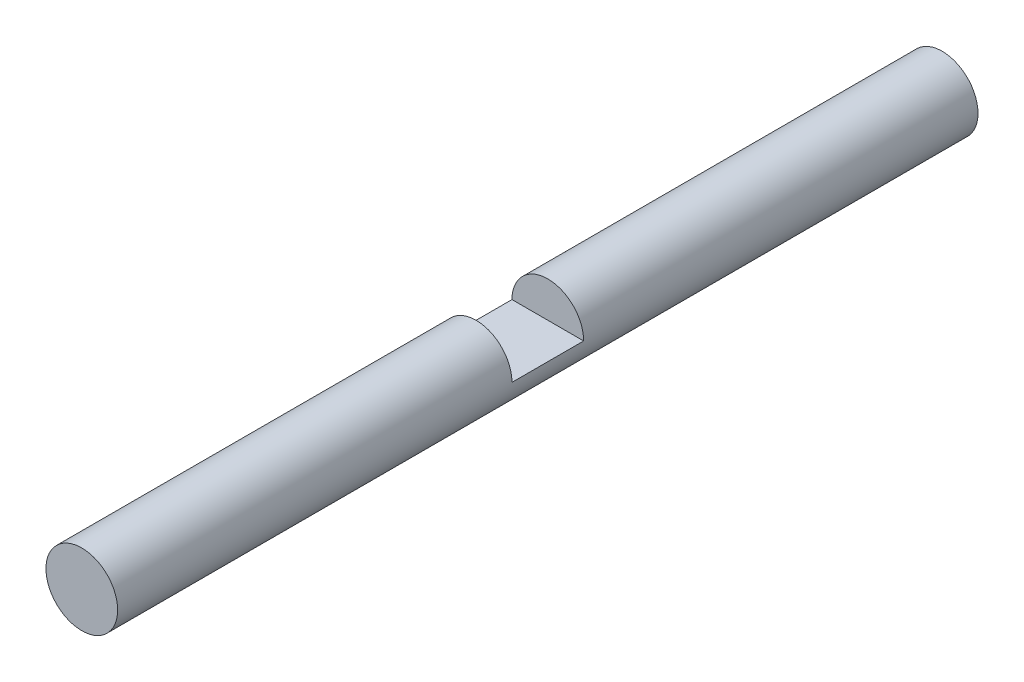
ISO-10303-21;
HEADER;
FILE_DESCRIPTION(('STEP AP214'),'2;1');
FILE_NAME('part.step','',(''),(''),'','','');
FILE_SCHEMA(('AUTOMOTIVE_DESIGN { 1 0 10303 214 1 1 1 1 }'));
ENDSEC;
DATA;
#1=APPLICATION_CONTEXT('core data for automotive mechanical design processes');
#2=APPLICATION_PROTOCOL_DEFINITION('international standard','automotive_design',2000,#1);
#3=PRODUCT_CONTEXT('',#1,'mechanical');
#4=PRODUCT('Part','Part','',(#3));
#5=PRODUCT_RELATED_PRODUCT_CATEGORY('part','',(#4));
#6=PRODUCT_DEFINITION_FORMATION('','',#4);
#7=PRODUCT_DEFINITION_CONTEXT('part definition',#1,'design');
#8=PRODUCT_DEFINITION('design','',#6,#7);
#9=PRODUCT_DEFINITION_SHAPE('','',#8);
#10=(LENGTH_UNIT() NAMED_UNIT(*) SI_UNIT(.MILLI.,.METRE.));
#11=(NAMED_UNIT(*) PLANE_ANGLE_UNIT() SI_UNIT($,.RADIAN.));
#12=(NAMED_UNIT(*) SI_UNIT($,.STERADIAN.) SOLID_ANGLE_UNIT());
#13=UNCERTAINTY_MEASURE_WITH_UNIT(LENGTH_MEASURE(1.E-05),#10,'distance_accuracy_value','');
#14=(GEOMETRIC_REPRESENTATION_CONTEXT(3) GLOBAL_UNCERTAINTY_ASSIGNED_CONTEXT((#13)) GLOBAL_UNIT_ASSIGNED_CONTEXT((#10,
#11,#12)) REPRESENTATION_CONTEXT('',''));
#15=CARTESIAN_POINT('',(0.,0.,0.));
#16=DIRECTION('',(0.,0.,1.));
#17=DIRECTION('',(1.,0.,0.));
#18=AXIS2_PLACEMENT_3D('',#15,#16,#17);
#19=CARTESIAN_POINT('',(0.,0.,-30.));
#20=DIRECTION('',(0.,0.,1.));
#21=DIRECTION('',(1.,0.,0.));
#22=AXIS2_PLACEMENT_3D('',#19,#20,#21);
#23=CYLINDRICAL_SURFACE('',#22,2.5);
#24=CARTESIAN_POINT('',(0.,0.,-30.));
#25=DIRECTION('',(0.,0.,1.));
#26=DIRECTION('',(1.,0.,0.));
#27=AXIS2_PLACEMENT_3D('',#24,#25,#26);
#28=CIRCLE('',#27,2.5);
#29=CARTESIAN_POINT('',(2.5,0.,-30.));
#30=VERTEX_POINT('',#29);
#31=EDGE_CURVE('E75',#30,#30,#28,.T.);
#32=ORIENTED_EDGE('',*,*,#31,.T.);
#33=EDGE_LOOP('',(#32));
#34=FACE_BOUND('',#33,.T.);
#35=CARTESIAN_POINT('',(0.,0.,30.));
#36=DIRECTION('',(0.,0.,1.));
#37=DIRECTION('',(1.,0.,0.));
#38=AXIS2_PLACEMENT_3D('',#35,#36,#37);
#39=CIRCLE('',#38,2.5);
#40=CARTESIAN_POINT('',(2.5,0.,30.));
#41=VERTEX_POINT('',#40);
#42=EDGE_CURVE('E70',#41,#41,#39,.T.);
#43=ORIENTED_EDGE('',*,*,#42,.F.);
#44=EDGE_LOOP('',(#43));
#45=FACE_BOUND('',#44,.T.);
#46=DIRECTION('',(0.,0.,1.));
#47=VECTOR('',#46,1.);
#48=CARTESIAN_POINT('',(-2.5,0.,2.5));
#49=LINE('',#48,#47);
#50=CARTESIAN_POINT('',(-2.5,0.,-2.5));
#51=VERTEX_POINT('',#50);
#52=CARTESIAN_POINT('',(-2.5,0.,2.5));
#53=VERTEX_POINT('',#52);
#54=EDGE_CURVE('E61',#51,#53,#49,.T.);
#55=ORIENTED_EDGE('',*,*,#54,.F.);
#56=CARTESIAN_POINT('',(0.,0.,-2.5));
#57=DIRECTION('',(0.,0.,1.));
#58=DIRECTION('',(1.,0.,0.));
#59=AXIS2_PLACEMENT_3D('',#56,#57,#58);
#60=CIRCLE('',#59,2.5);
#61=CARTESIAN_POINT('',(2.5,0.,-2.5));
#62=VERTEX_POINT('',#61);
#63=EDGE_CURVE('E11',#51,#62,#60,.F.);
#64=ORIENTED_EDGE('',*,*,#63,.T.);
#65=DIRECTION('',(0.,0.,-1.));
#66=VECTOR('',#65,1.);
#67=CARTESIAN_POINT('',(2.5,0.,2.5));
#68=LINE('',#67,#66);
#69=CARTESIAN_POINT('',(2.5,0.,2.5));
#70=VERTEX_POINT('',#69);
#71=EDGE_CURVE('E62',#70,#62,#68,.T.);
#72=ORIENTED_EDGE('',*,*,#71,.F.);
#73=CARTESIAN_POINT('',(0.,0.,2.5));
#74=DIRECTION('',(0.,0.,-1.));
#75=DIRECTION('',(-1.,0.,0.));
#76=AXIS2_PLACEMENT_3D('',#73,#74,#75);
#77=CIRCLE('',#76,2.5);
#78=EDGE_CURVE('E40',#70,#53,#77,.F.);
#79=ORIENTED_EDGE('',*,*,#78,.T.);
#80=EDGE_LOOP('',(#55,#64,#72,#79));
#81=FACE_BOUND('',#80,.T.);
#82=ADVANCED_FACE('F33',(#34,#45,#81),#23,.T.);
#83=CARTESIAN_POINT('',(0.,0.,-30.));
#84=DIRECTION('',(0.,0.,1.));
#85=DIRECTION('',(1.,0.,0.));
#86=AXIS2_PLACEMENT_3D('',#83,#84,#85);
#87=PLANE('',#86);
#88=ORIENTED_EDGE('',*,*,#31,.F.);
#89=EDGE_LOOP('',(#88));
#90=FACE_BOUND('',#89,.T.);
#91=ADVANCED_FACE('F81',(#90),#87,.F.);
#92=CARTESIAN_POINT('',(0.,0.,30.));
#93=DIRECTION('',(0.,0.,1.));
#94=DIRECTION('',(1.,0.,0.));
#95=AXIS2_PLACEMENT_3D('',#92,#93,#94);
#96=PLANE('',#95);
#97=ORIENTED_EDGE('',*,*,#42,.T.);
#98=EDGE_LOOP('',(#97));
#99=FACE_BOUND('',#98,.T.);
#100=ADVANCED_FACE('F83',(#99),#96,.T.);
#101=CARTESIAN_POINT('',(-2.5,10.,-2.5));
#102=DIRECTION('',(0.,0.,1.));
#103=DIRECTION('',(1.,0.,0.));
#104=AXIS2_PLACEMENT_3D('',#101,#102,#103);
#105=PLANE('',#104);
#106=DIRECTION('',(-1.,0.,0.));
#107=VECTOR('',#106,1.);
#108=CARTESIAN_POINT('',(-2.5,0.,-2.5));
#109=LINE('',#108,#107);
#110=EDGE_CURVE('E47',#62,#51,#109,.T.);
#111=ORIENTED_EDGE('',*,*,#110,.F.);
#112=ORIENTED_EDGE('',*,*,#63,.F.);
#113=EDGE_LOOP('',(#111,#112));
#114=FACE_BOUND('',#113,.T.);
#115=ADVANCED_FACE('F59',(#114),#105,.T.);
#116=CARTESIAN_POINT('',(-2.5,10.,2.5));
#117=DIRECTION('',(0.,0.,-1.));
#118=DIRECTION('',(-1.,0.,0.));
#119=AXIS2_PLACEMENT_3D('',#116,#117,#118);
#120=PLANE('',#119);
#121=DIRECTION('',(1.,0.,0.));
#122=VECTOR('',#121,1.);
#123=CARTESIAN_POINT('',(-2.5,0.,2.5));
#124=LINE('',#123,#122);
#125=EDGE_CURVE('E66',#53,#70,#124,.T.);
#126=ORIENTED_EDGE('',*,*,#125,.F.);
#127=ORIENTED_EDGE('',*,*,#78,.F.);
#128=EDGE_LOOP('',(#126,#127));
#129=FACE_BOUND('',#128,.T.);
#130=ADVANCED_FACE('F93',(#129),#120,.T.);
#131=CARTESIAN_POINT('',(0.,0.,0.));
#132=DIRECTION('',(0.,-1.,0.));
#133=DIRECTION('',(0.,0.,-1.));
#134=AXIS2_PLACEMENT_3D('',#131,#132,#133);
#135=PLANE('',#134);
#136=ORIENTED_EDGE('',*,*,#71,.T.);
#137=ORIENTED_EDGE('',*,*,#110,.T.);
#138=ORIENTED_EDGE('',*,*,#54,.T.);
#139=ORIENTED_EDGE('',*,*,#125,.T.);
#140=EDGE_LOOP('',(#136,#137,#138,#139));
#141=FACE_BOUND('',#140,.T.);
#142=ADVANCED_FACE('F65',(#141),#135,.F.);
#143=CLOSED_SHELL('',(#82,#91,#100,#115,#130,#142));
#144=MANIFOLD_SOLID_BREP('B2',#143);
#145=ADVANCED_BREP_SHAPE_REPRESENTATION('',(#18,#144),#14);
#146=SHAPE_DEFINITION_REPRESENTATION(#9,#145);
ENDSEC;
END-ISO-10303-21;
